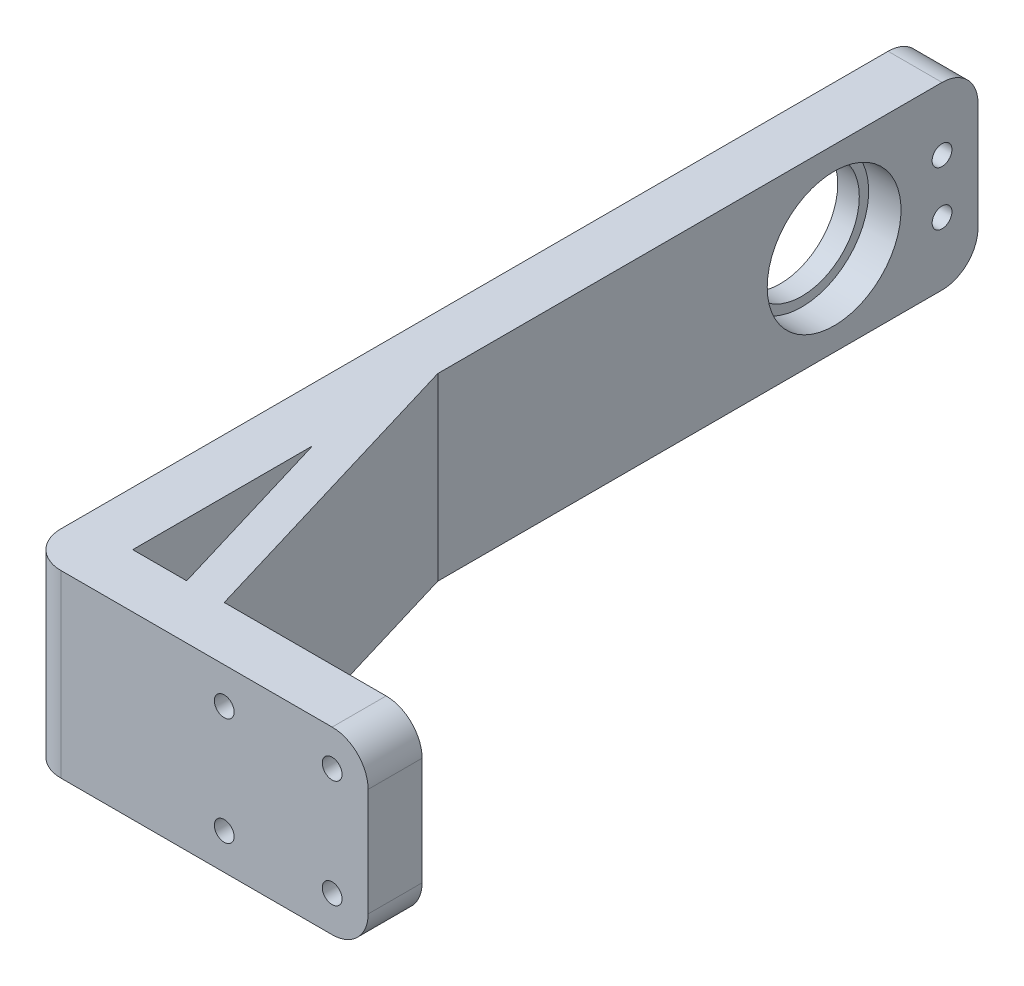
ISO-10303-21;
HEADER;
FILE_DESCRIPTION(('STEP AP214'),'2;1');
FILE_NAME('part.step','',(''),(''),'','','');
FILE_SCHEMA(('AUTOMOTIVE_DESIGN { 1 0 10303 214 1 1 1 1 }'));
ENDSEC;
DATA;
#1=APPLICATION_CONTEXT('core data for automotive mechanical design processes');
#2=APPLICATION_PROTOCOL_DEFINITION('international standard','automotive_design',2000,#1);
#3=PRODUCT_CONTEXT('',#1,'mechanical');
#4=PRODUCT('Part','Part','',(#3));
#5=PRODUCT_RELATED_PRODUCT_CATEGORY('part','',(#4));
#6=PRODUCT_DEFINITION_FORMATION('','',#4);
#7=PRODUCT_DEFINITION_CONTEXT('part definition',#1,'design');
#8=PRODUCT_DEFINITION('design','',#6,#7);
#9=PRODUCT_DEFINITION_SHAPE('','',#8);
#10=(LENGTH_UNIT() NAMED_UNIT(*) SI_UNIT(.MILLI.,.METRE.));
#11=(NAMED_UNIT(*) PLANE_ANGLE_UNIT() SI_UNIT($,.RADIAN.));
#12=(NAMED_UNIT(*) SI_UNIT($,.STERADIAN.) SOLID_ANGLE_UNIT());
#13=UNCERTAINTY_MEASURE_WITH_UNIT(LENGTH_MEASURE(1.E-05),#10,'distance_accuracy_value','');
#14=(GEOMETRIC_REPRESENTATION_CONTEXT(3) GLOBAL_UNCERTAINTY_ASSIGNED_CONTEXT((#13)) GLOBAL_UNIT_ASSIGNED_CONTEXT((#10,
#11,#12)) REPRESENTATION_CONTEXT('',''));
#15=CARTESIAN_POINT('',(0.,0.,0.));
#16=DIRECTION('',(0.,0.,1.));
#17=DIRECTION('',(1.,0.,0.));
#18=AXIS2_PLACEMENT_3D('',#15,#16,#17);
#19=CARTESIAN_POINT('',(15.,50.,0.));
#20=DIRECTION('',(-1.,0.,0.));
#21=DIRECTION('',(0.,0.,1.));
#22=AXIS2_PLACEMENT_3D('',#19,#20,#21);
#23=PLANE('',#22);
#24=DIRECTION('',(0.,0.,-1.));
#25=VECTOR('',#24,1.);
#26=CARTESIAN_POINT('',(15.,0.,0.));
#27=LINE('',#26,#25);
#28=CARTESIAN_POINT('',(15.,0.,-15.));
#29=VERTEX_POINT('',#28);
#30=CARTESIAN_POINT('',(15.,0.,-65.));
#31=VERTEX_POINT('',#30);
#32=EDGE_CURVE('E272',#29,#31,#27,.T.);
#33=ORIENTED_EDGE('',*,*,#32,.T.);
#34=DIRECTION('',(0.,-1.,0.));
#35=VECTOR('',#34,1.);
#36=CARTESIAN_POINT('',(15.,50.,-65.));
#37=LINE('',#36,#35);
#38=CARTESIAN_POINT('',(15.,50.,-65.));
#39=VERTEX_POINT('',#38);
#40=EDGE_CURVE('E195',#39,#31,#37,.T.);
#41=ORIENTED_EDGE('',*,*,#40,.F.);
#42=DIRECTION('',(0.,0.,-1.));
#43=VECTOR('',#42,1.);
#44=CARTESIAN_POINT('',(15.,50.,0.));
#45=LINE('',#44,#43);
#46=CARTESIAN_POINT('',(15.,50.,-15.));
#47=VERTEX_POINT('',#46);
#48=EDGE_CURVE('E160',#47,#39,#45,.T.);
#49=ORIENTED_EDGE('',*,*,#48,.F.);
#50=DIRECTION('',(0.,-1.,0.));
#51=VECTOR('',#50,1.);
#52=CARTESIAN_POINT('',(15.,50.,-15.));
#53=LINE('',#52,#51);
#54=EDGE_CURVE('E176',#47,#29,#53,.T.);
#55=ORIENTED_EDGE('',*,*,#54,.T.);
#56=EDGE_LOOP('',(#33,#41,#49,#55));
#57=FACE_BOUND('',#56,.T.);
#58=ADVANCED_FACE('F41',(#57),#23,.F.);
#59=CARTESIAN_POINT('',(31.651376146789,50.,-9.4954128440367));
#60=DIRECTION('',(0.957826285221152,0.,-0.287347885566345));
#61=DIRECTION('',(-0.287347885566345,0.,-0.957826285221152));
#62=AXIS2_PLACEMENT_3D('',#59,#60,#61);
#63=PLANE('',#62);
#64=DIRECTION('',(0.287347885566345,0.,0.957826285221151));
#65=VECTOR('',#64,1.);
#66=CARTESIAN_POINT('',(31.651376146789,0.,-9.4954128440367));
#67=LINE('',#66,#65);
#68=CARTESIAN_POINT('',(30.,0.,-15.));
#69=VERTEX_POINT('',#68);
#70=EDGE_CURVE('E278',#31,#69,#67,.T.);
#71=ORIENTED_EDGE('',*,*,#70,.T.);
#72=DIRECTION('',(0.,-1.,0.));
#73=VECTOR('',#72,1.);
#74=CARTESIAN_POINT('',(30.,50.,-15.));
#75=LINE('',#74,#73);
#76=CARTESIAN_POINT('',(30.,50.,-15.));
#77=VERTEX_POINT('',#76);
#78=EDGE_CURVE('E180',#77,#69,#75,.T.);
#79=ORIENTED_EDGE('',*,*,#78,.F.);
#80=DIRECTION('',(0.287347885566345,0.,0.957826285221151));
#81=VECTOR('',#80,1.);
#82=CARTESIAN_POINT('',(31.651376146789,50.,-9.4954128440367));
#83=LINE('',#82,#81);
#84=EDGE_CURVE('E269',#39,#77,#83,.T.);
#85=ORIENTED_EDGE('',*,*,#84,.F.);
#86=ORIENTED_EDGE('',*,*,#40,.T.);
#87=EDGE_LOOP('',(#71,#79,#85,#86));
#88=FACE_BOUND('',#87,.T.);
#89=ADVANCED_FACE('F327',(#88),#63,.F.);
#90=CARTESIAN_POINT('',(41.2296389990005,50.,-12.3688916997002));
#91=DIRECTION('',(-0.957826285221151,0.,0.287347885566345));
#92=DIRECTION('',(0.287347885566346,0.,0.957826285221152));
#93=AXIS2_PLACEMENT_3D('',#90,#91,#92);
#94=PLANE('',#93);
#95=DIRECTION('',(-0.287347885566346,0.,-0.957826285221151));
#96=VECTOR('',#95,1.);
#97=CARTESIAN_POINT('',(41.2296389990005,0.,-12.3688916997002));
#98=LINE('',#97,#96);
#99=CARTESIAN_POINT('',(40.4403065089105,0.,-15.));
#100=VERTEX_POINT('',#99);
#101=CARTESIAN_POINT('',(15.,0.,-99.8010216963685));
#102=VERTEX_POINT('',#101);
#103=EDGE_CURVE('E175',#100,#102,#98,.T.);
#104=ORIENTED_EDGE('',*,*,#103,.T.);
#105=DIRECTION('',(0.,-1.,0.));
#106=VECTOR('',#105,1.);
#107=CARTESIAN_POINT('',(15.,50.,-99.8010216963685));
#108=LINE('',#107,#106);
#109=CARTESIAN_POINT('',(15.,50.,-99.8010216963685));
#110=VERTEX_POINT('',#109);
#111=EDGE_CURVE('E151',#110,#102,#108,.T.);
#112=ORIENTED_EDGE('',*,*,#111,.F.);
#113=DIRECTION('',(-0.287347885566346,0.,-0.957826285221151));
#114=VECTOR('',#113,1.);
#115=CARTESIAN_POINT('',(41.2296389990005,50.,-12.3688916997002));
#116=LINE('',#115,#114);
#117=CARTESIAN_POINT('',(40.4403065089105,50.,-15.));
#118=VERTEX_POINT('',#117);
#119=EDGE_CURVE('E158',#118,#110,#116,.T.);
#120=ORIENTED_EDGE('',*,*,#119,.F.);
#121=DIRECTION('',(0.,-1.,0.));
#122=VECTOR('',#121,1.);
#123=CARTESIAN_POINT('',(40.4403065089105,50.,-15.));
#124=LINE('',#123,#122);
#125=EDGE_CURVE('E284',#118,#100,#124,.T.);
#126=ORIENTED_EDGE('',*,*,#125,.T.);
#127=EDGE_LOOP('',(#104,#112,#120,#126));
#128=FACE_BOUND('',#127,.T.);
#129=ADVANCED_FACE('F173',(#128),#94,.F.);
#130=CARTESIAN_POINT('',(15.,32.5,-240.));
#131=DIRECTION('',(-1.,0.,0.));
#132=DIRECTION('',(0.,0.,1.));
#133=AXIS2_PLACEMENT_3D('',#130,#131,#132);
#134=CIRCLE('',#133,2.74999999999998);
#135=CARTESIAN_POINT('',(15.,32.5,-237.25));
#136=VERTEX_POINT('',#135);
#137=EDGE_CURVE('E209',#136,#136,#134,.T.);
#138=ORIENTED_EDGE('',*,*,#137,.T.);
#139=EDGE_LOOP('',(#138));
#140=FACE_BOUND('',#139,.T.);
#141=CARTESIAN_POINT('',(15.,17.5,-240.));
#142=DIRECTION('',(-1.,0.,0.));
#143=DIRECTION('',(0.,0.,1.));
#144=AXIS2_PLACEMENT_3D('',#141,#142,#143);
#145=CIRCLE('',#144,2.74999999999998);
#146=CARTESIAN_POINT('',(15.,17.5,-237.25));
#147=VERTEX_POINT('',#146);
#148=EDGE_CURVE('E204',#147,#147,#145,.T.);
#149=ORIENTED_EDGE('',*,*,#148,.T.);
#150=EDGE_LOOP('',(#149));
#151=FACE_BOUND('',#150,.T.);
#152=CARTESIAN_POINT('',(15.,25.,-210.));
#153=DIRECTION('',(-1.,0.,0.));
#154=DIRECTION('',(0.,0.,1.));
#155=AXIS2_PLACEMENT_3D('',#152,#153,#154);
#156=CIRCLE('',#155,18.6);
#157=CARTESIAN_POINT('',(15.,25.,-191.4));
#158=VERTEX_POINT('',#157);
#159=EDGE_CURVE('E207',#158,#158,#156,.T.);
#160=ORIENTED_EDGE('',*,*,#159,.T.);
#161=EDGE_LOOP('',(#160));
#162=FACE_BOUND('',#161,.T.);
#163=CARTESIAN_POINT('',(15.,0.,-240.));
#164=VERTEX_POINT('',#163);
#165=EDGE_CURVE('E256',#102,#164,#27,.T.);
#166=ORIENTED_EDGE('',*,*,#165,.T.);
#167=CARTESIAN_POINT('',(15.,10.,-240.));
#168=DIRECTION('',(-1.,0.,0.));
#169=DIRECTION('',(0.,0.,1.));
#170=AXIS2_PLACEMENT_3D('',#167,#168,#169);
#171=CIRCLE('',#170,10.);
#172=CARTESIAN_POINT('',(15.,10.,-250.));
#173=VERTEX_POINT('',#172);
#174=EDGE_CURVE('E11',#164,#173,#171,.F.);
#175=ORIENTED_EDGE('',*,*,#174,.T.);
#176=DIRECTION('',(0.,-1.,0.));
#177=VECTOR('',#176,1.);
#178=CARTESIAN_POINT('',(15.,50.,-250.));
#179=LINE('',#178,#177);
#180=CARTESIAN_POINT('',(15.,40.,-250.));
#181=VERTEX_POINT('',#180);
#182=EDGE_CURVE('E177',#181,#173,#179,.T.);
#183=ORIENTED_EDGE('',*,*,#182,.F.);
#184=CARTESIAN_POINT('',(15.,40.,-240.));
#185=DIRECTION('',(-1.,0.,0.));
#186=DIRECTION('',(0.,0.,1.));
#187=AXIS2_PLACEMENT_3D('',#184,#185,#186);
#188=CIRCLE('',#187,10.);
#189=CARTESIAN_POINT('',(15.,50.,-240.));
#190=VERTEX_POINT('',#189);
#191=EDGE_CURVE('E49',#181,#190,#188,.F.);
#192=ORIENTED_EDGE('',*,*,#191,.T.);
#193=EDGE_CURVE('E147',#110,#190,#45,.T.);
#194=ORIENTED_EDGE('',*,*,#193,.F.);
#195=ORIENTED_EDGE('',*,*,#111,.T.);
#196=EDGE_LOOP('',(#166,#175,#183,#192,#194,#195));
#197=FACE_BOUND('',#196,.T.);
#198=ADVANCED_FACE('F149',(#140,#151,#162,#197),#23,.F.);
#199=CARTESIAN_POINT('',(0.,50.,-250.));
#200=DIRECTION('',(0.,0.,1.));
#201=DIRECTION('',(1.,0.,0.));
#202=AXIS2_PLACEMENT_3D('',#199,#200,#201);
#203=PLANE('',#202);
#204=ORIENTED_EDGE('',*,*,#182,.T.);
#205=DIRECTION('',(-1.,0.,0.));
#206=VECTOR('',#205,1.);
#207=CARTESIAN_POINT('',(0.,10.,-250.));
#208=LINE('',#207,#206);
#209=CARTESIAN_POINT('',(0.,10.,-250.));
#210=VERTEX_POINT('',#209);
#211=EDGE_CURVE('E235',#173,#210,#208,.T.);
#212=ORIENTED_EDGE('',*,*,#211,.T.);
#213=DIRECTION('',(0.,-1.,0.));
#214=VECTOR('',#213,1.);
#215=CARTESIAN_POINT('',(0.,50.,-250.));
#216=LINE('',#215,#214);
#217=CARTESIAN_POINT('',(0.,40.,-250.));
#218=VERTEX_POINT('',#217);
#219=EDGE_CURVE('E182',#218,#210,#216,.T.);
#220=ORIENTED_EDGE('',*,*,#219,.F.);
#221=DIRECTION('',(-1.,0.,0.));
#222=VECTOR('',#221,1.);
#223=CARTESIAN_POINT('',(15.,40.,-250.));
#224=LINE('',#223,#222);
#225=EDGE_CURVE('E61',#218,#181,#224,.F.);
#226=ORIENTED_EDGE('',*,*,#225,.T.);
#227=EDGE_LOOP('',(#204,#212,#220,#226));
#228=FACE_BOUND('',#227,.T.);
#229=ADVANCED_FACE('F259',(#228),#203,.F.);
#230=CARTESIAN_POINT('',(0.,50.,0.));
#231=DIRECTION('',(1.,0.,0.));
#232=DIRECTION('',(0.,0.,-1.));
#233=AXIS2_PLACEMENT_3D('',#230,#231,#232);
#234=PLANE('',#233);
#235=CARTESIAN_POINT('',(0.,32.5,-240.));
#236=DIRECTION('',(-1.,0.,0.));
#237=DIRECTION('',(0.,0.,1.));
#238=AXIS2_PLACEMENT_3D('',#235,#236,#237);
#239=CIRCLE('',#238,2.775);
#240=CARTESIAN_POINT('',(0.,32.5,-237.225));
#241=VERTEX_POINT('',#240);
#242=EDGE_CURVE('E424',#241,#241,#239,.T.);
#243=ORIENTED_EDGE('',*,*,#242,.F.);
#244=EDGE_LOOP('',(#243));
#245=FACE_BOUND('',#244,.T.);
#246=CARTESIAN_POINT('',(0.,17.5,-240.));
#247=DIRECTION('',(-1.,0.,0.));
#248=DIRECTION('',(0.,0.,1.));
#249=AXIS2_PLACEMENT_3D('',#246,#247,#248);
#250=CIRCLE('',#249,2.775);
#251=CARTESIAN_POINT('',(0.,17.5,-237.225));
#252=VERTEX_POINT('',#251);
#253=EDGE_CURVE('E212',#252,#252,#250,.T.);
#254=ORIENTED_EDGE('',*,*,#253,.F.);
#255=EDGE_LOOP('',(#254));
#256=FACE_BOUND('',#255,.T.);
#257=CARTESIAN_POINT('',(0.,25.,-210.));
#258=DIRECTION('',(1.,0.,0.));
#259=DIRECTION('',(0.,0.,-1.));
#260=AXIS2_PLACEMENT_3D('',#257,#258,#259);
#261=CIRCLE('',#260,16.);
#262=CARTESIAN_POINT('',(0.,25.,-226.));
#263=VERTEX_POINT('',#262);
#264=EDGE_CURVE('E189',#263,#263,#261,.T.);
#265=ORIENTED_EDGE('',*,*,#264,.T.);
#266=EDGE_LOOP('',(#265));
#267=FACE_BOUND('',#266,.T.);
#268=ORIENTED_EDGE('',*,*,#219,.T.);
#269=CARTESIAN_POINT('',(0.,10.,-240.));
#270=DIRECTION('',(1.,0.,0.));
#271=DIRECTION('',(0.,0.,-1.));
#272=AXIS2_PLACEMENT_3D('',#269,#270,#271);
#273=CIRCLE('',#272,10.);
#274=CARTESIAN_POINT('',(0.,0.,-240.));
#275=VERTEX_POINT('',#274);
#276=EDGE_CURVE('E240',#210,#275,#273,.F.);
#277=ORIENTED_EDGE('',*,*,#276,.T.);
#278=DIRECTION('',(0.,0.,1.));
#279=VECTOR('',#278,1.);
#280=CARTESIAN_POINT('',(0.,0.,0.));
#281=LINE('',#280,#279);
#282=CARTESIAN_POINT('',(0.,0.,-10.));
#283=VERTEX_POINT('',#282);
#284=EDGE_CURVE('E245',#275,#283,#281,.T.);
#285=ORIENTED_EDGE('',*,*,#284,.T.);
#286=DIRECTION('',(0.,-1.,0.));
#287=VECTOR('',#286,1.);
#288=CARTESIAN_POINT('',(0.,50.,-10.));
#289=LINE('',#288,#287);
#290=CARTESIAN_POINT('',(0.,50.,-10.));
#291=VERTEX_POINT('',#290);
#292=EDGE_CURVE('E198',#283,#291,#289,.F.);
#293=ORIENTED_EDGE('',*,*,#292,.T.);
#294=DIRECTION('',(0.,0.,1.));
#295=VECTOR('',#294,1.);
#296=CARTESIAN_POINT('',(0.,50.,0.));
#297=LINE('',#296,#295);
#298=CARTESIAN_POINT('',(0.,50.,-240.));
#299=VERTEX_POINT('',#298);
#300=EDGE_CURVE('E157',#299,#291,#297,.T.);
#301=ORIENTED_EDGE('',*,*,#300,.F.);
#302=CARTESIAN_POINT('',(0.,40.,-240.));
#303=DIRECTION('',(1.,0.,0.));
#304=DIRECTION('',(0.,0.,-1.));
#305=AXIS2_PLACEMENT_3D('',#302,#303,#304);
#306=CIRCLE('',#305,10.);
#307=EDGE_CURVE('E238',#299,#218,#306,.F.);
#308=ORIENTED_EDGE('',*,*,#307,.T.);
#309=EDGE_LOOP('',(#268,#277,#285,#293,#301,#308));
#310=FACE_BOUND('',#309,.T.);
#311=ADVANCED_FACE('F244',(#245,#256,#267,#310),#234,.F.);
#312=CARTESIAN_POINT('',(0.,50.,0.));
#313=DIRECTION('',(0.,0.,-1.));
#314=DIRECTION('',(-1.,0.,0.));
#315=AXIS2_PLACEMENT_3D('',#312,#313,#314);
#316=PLANE('',#315);
#317=CARTESIAN_POINT('',(85.4403065089106,40.,0.));
#318=DIRECTION('',(0.,0.,-1.));
#319=DIRECTION('',(-1.,0.,0.));
#320=AXIS2_PLACEMENT_3D('',#317,#318,#319);
#321=CIRCLE('',#320,2.74999999999999);
#322=CARTESIAN_POINT('',(82.6903065089106,40.,0.));
#323=VERTEX_POINT('',#322);
#324=EDGE_CURVE('E695',#323,#323,#321,.T.);
#325=ORIENTED_EDGE('',*,*,#324,.T.);
#326=EDGE_LOOP('',(#325));
#327=FACE_BOUND('',#326,.T.);
#328=CARTESIAN_POINT('',(55.4403065089106,10.,0.));
#329=DIRECTION('',(0.,0.,-1.));
#330=DIRECTION('',(-1.,0.,0.));
#331=AXIS2_PLACEMENT_3D('',#328,#329,#330);
#332=CIRCLE('',#331,2.74999999999999);
#333=CARTESIAN_POINT('',(52.6903065089106,10.,0.));
#334=VERTEX_POINT('',#333);
#335=EDGE_CURVE('E707',#334,#334,#332,.T.);
#336=ORIENTED_EDGE('',*,*,#335,.T.);
#337=EDGE_LOOP('',(#336));
#338=FACE_BOUND('',#337,.T.);
#339=CARTESIAN_POINT('',(85.4403065089106,10.,0.));
#340=DIRECTION('',(0.,0.,-1.));
#341=DIRECTION('',(-1.,0.,0.));
#342=AXIS2_PLACEMENT_3D('',#339,#340,#341);
#343=CIRCLE('',#342,2.74999999999999);
#344=CARTESIAN_POINT('',(82.6903065089106,10.,0.));
#345=VERTEX_POINT('',#344);
#346=EDGE_CURVE('E412',#345,#345,#343,.T.);
#347=ORIENTED_EDGE('',*,*,#346,.T.);
#348=EDGE_LOOP('',(#347));
#349=FACE_BOUND('',#348,.T.);
#350=CARTESIAN_POINT('',(55.4403065089106,40.,0.));
#351=DIRECTION('',(0.,0.,-1.));
#352=DIRECTION('',(-1.,0.,0.));
#353=AXIS2_PLACEMENT_3D('',#350,#351,#352);
#354=CIRCLE('',#353,2.74999999999999);
#355=CARTESIAN_POINT('',(52.6903065089106,40.,0.));
#356=VERTEX_POINT('',#355);
#357=EDGE_CURVE('E415',#356,#356,#354,.T.);
#358=ORIENTED_EDGE('',*,*,#357,.T.);
#359=EDGE_LOOP('',(#358));
#360=FACE_BOUND('',#359,.T.);
#361=DIRECTION('',(0.,-1.,0.));
#362=VECTOR('',#361,1.);
#363=CARTESIAN_POINT('',(95.4403065089106,50.,0.));
#364=LINE('',#363,#362);
#365=CARTESIAN_POINT('',(95.4403065089106,40.,0.));
#366=VERTEX_POINT('',#365);
#367=CARTESIAN_POINT('',(95.4403065089106,10.,0.));
#368=VERTEX_POINT('',#367);
#369=EDGE_CURVE('E289',#366,#368,#364,.T.);
#370=ORIENTED_EDGE('',*,*,#369,.F.);
#371=CARTESIAN_POINT('',(85.4403065089106,40.,0.));
#372=DIRECTION('',(0.,0.,-1.));
#373=DIRECTION('',(-1.,0.,0.));
#374=AXIS2_PLACEMENT_3D('',#371,#372,#373);
#375=CIRCLE('',#374,10.);
#376=CARTESIAN_POINT('',(85.4403065089106,50.,0.));
#377=VERTEX_POINT('',#376);
#378=EDGE_CURVE('E228',#366,#377,#375,.F.);
#379=ORIENTED_EDGE('',*,*,#378,.T.);
#380=DIRECTION('',(1.,0.,0.));
#381=VECTOR('',#380,1.);
#382=CARTESIAN_POINT('',(0.,50.,0.));
#383=LINE('',#382,#381);
#384=CARTESIAN_POINT('',(10.,50.,0.));
#385=VERTEX_POINT('',#384);
#386=EDGE_CURVE('E263',#385,#377,#383,.T.);
#387=ORIENTED_EDGE('',*,*,#386,.F.);
#388=DIRECTION('',(0.,-1.,0.));
#389=VECTOR('',#388,1.);
#390=CARTESIAN_POINT('',(10.,50.,0.));
#391=LINE('',#390,#389);
#392=CARTESIAN_POINT('',(10.,0.,0.));
#393=VERTEX_POINT('',#392);
#394=EDGE_CURVE('E191',#385,#393,#391,.T.);
#395=ORIENTED_EDGE('',*,*,#394,.T.);
#396=DIRECTION('',(1.,0.,0.));
#397=VECTOR('',#396,1.);
#398=CARTESIAN_POINT('',(0.,0.,0.));
#399=LINE('',#398,#397);
#400=CARTESIAN_POINT('',(85.4403065089106,0.,0.));
#401=VERTEX_POINT('',#400);
#402=EDGE_CURVE('E255',#393,#401,#399,.T.);
#403=ORIENTED_EDGE('',*,*,#402,.T.);
#404=CARTESIAN_POINT('',(85.4403065089106,10.,0.));
#405=DIRECTION('',(0.,0.,-1.));
#406=DIRECTION('',(-1.,0.,0.));
#407=AXIS2_PLACEMENT_3D('',#404,#405,#406);
#408=CIRCLE('',#407,10.);
#409=EDGE_CURVE('E226',#401,#368,#408,.F.);
#410=ORIENTED_EDGE('',*,*,#409,.T.);
#411=EDGE_LOOP('',(#370,#379,#387,#395,#403,#410));
#412=FACE_BOUND('',#411,.T.);
#413=ADVANCED_FACE('F305',(#327,#338,#349,#360,#412),#316,.F.);
#414=CARTESIAN_POINT('',(95.4403065089106,50.,0.));
#415=DIRECTION('',(-1.,0.,0.));
#416=DIRECTION('',(0.,0.,1.));
#417=AXIS2_PLACEMENT_3D('',#414,#415,#416);
#418=PLANE('',#417);
#419=DIRECTION('',(0.,-1.,0.));
#420=VECTOR('',#419,1.);
#421=CARTESIAN_POINT('',(95.4403065089106,50.,-15.));
#422=LINE('',#421,#420);
#423=CARTESIAN_POINT('',(95.4403065089106,40.,-15.));
#424=VERTEX_POINT('',#423);
#425=CARTESIAN_POINT('',(95.4403065089106,10.,-15.));
#426=VERTEX_POINT('',#425);
#427=EDGE_CURVE('E286',#424,#426,#422,.T.);
#428=ORIENTED_EDGE('',*,*,#427,.F.);
#429=DIRECTION('',(0.,0.,-1.));
#430=VECTOR('',#429,1.);
#431=CARTESIAN_POINT('',(95.4403065089106,40.,0.));
#432=LINE('',#431,#430);
#433=EDGE_CURVE('E224',#424,#366,#432,.F.);
#434=ORIENTED_EDGE('',*,*,#433,.T.);
#435=ORIENTED_EDGE('',*,*,#369,.T.);
#436=DIRECTION('',(0.,0.,-1.));
#437=VECTOR('',#436,1.);
#438=CARTESIAN_POINT('',(95.4403065089106,10.,0.));
#439=LINE('',#438,#437);
#440=EDGE_CURVE('E221',#368,#426,#439,.T.);
#441=ORIENTED_EDGE('',*,*,#440,.T.);
#442=EDGE_LOOP('',(#428,#434,#435,#441));
#443=FACE_BOUND('',#442,.T.);
#444=ADVANCED_FACE('F295',(#443),#418,.F.);
#445=CARTESIAN_POINT('',(0.,50.,-15.));
#446=DIRECTION('',(0.,0.,1.));
#447=DIRECTION('',(1.,0.,0.));
#448=AXIS2_PLACEMENT_3D('',#445,#446,#447);
#449=PLANE('',#448);
#450=CARTESIAN_POINT('',(85.4403065089106,40.,-15.));
#451=DIRECTION('',(0.,0.,-1.));
#452=DIRECTION('',(-1.,0.,0.));
#453=AXIS2_PLACEMENT_3D('',#450,#451,#452);
#454=CIRCLE('',#453,2.775);
#455=CARTESIAN_POINT('',(82.6653065089106,40.,-15.));
#456=VERTEX_POINT('',#455);
#457=EDGE_CURVE('E398',#456,#456,#454,.T.);
#458=ORIENTED_EDGE('',*,*,#457,.F.);
#459=EDGE_LOOP('',(#458));
#460=FACE_BOUND('',#459,.T.);
#461=CARTESIAN_POINT('',(55.4403065089106,10.,-15.));
#462=DIRECTION('',(0.,0.,-1.));
#463=DIRECTION('',(-1.,0.,0.));
#464=AXIS2_PLACEMENT_3D('',#461,#462,#463);
#465=CIRCLE('',#464,2.775);
#466=CARTESIAN_POINT('',(52.6653065089106,10.,-15.));
#467=VERTEX_POINT('',#466);
#468=EDGE_CURVE('E402',#467,#467,#465,.T.);
#469=ORIENTED_EDGE('',*,*,#468,.F.);
#470=EDGE_LOOP('',(#469));
#471=FACE_BOUND('',#470,.T.);
#472=CARTESIAN_POINT('',(85.4403065089106,10.,-15.));
#473=DIRECTION('',(0.,0.,-1.));
#474=DIRECTION('',(-1.,0.,0.));
#475=AXIS2_PLACEMENT_3D('',#472,#473,#474);
#476=CIRCLE('',#475,2.775);
#477=CARTESIAN_POINT('',(82.6653065089106,10.,-15.));
#478=VERTEX_POINT('',#477);
#479=EDGE_CURVE('E406',#478,#478,#476,.T.);
#480=ORIENTED_EDGE('',*,*,#479,.F.);
#481=EDGE_LOOP('',(#480));
#482=FACE_BOUND('',#481,.T.);
#483=CARTESIAN_POINT('',(55.4403065089106,40.,-15.));
#484=DIRECTION('',(0.,0.,-1.));
#485=DIRECTION('',(-1.,0.,0.));
#486=AXIS2_PLACEMENT_3D('',#483,#484,#485);
#487=CIRCLE('',#486,2.775);
#488=CARTESIAN_POINT('',(52.6653065089106,40.,-15.));
#489=VERTEX_POINT('',#488);
#490=EDGE_CURVE('E409',#489,#489,#487,.T.);
#491=ORIENTED_EDGE('',*,*,#490,.F.);
#492=EDGE_LOOP('',(#491));
#493=FACE_BOUND('',#492,.T.);
#494=DIRECTION('',(-1.,0.,0.));
#495=VECTOR('',#494,1.);
#496=CARTESIAN_POINT('',(0.,50.,-15.));
#497=LINE('',#496,#495);
#498=CARTESIAN_POINT('',(85.4403065089106,50.,-15.));
#499=VERTEX_POINT('',#498);
#500=EDGE_CURVE('E167',#499,#118,#497,.T.);
#501=ORIENTED_EDGE('',*,*,#500,.F.);
#502=CARTESIAN_POINT('',(85.4403065089106,40.,-15.));
#503=DIRECTION('',(0.,0.,1.));
#504=DIRECTION('',(1.,0.,0.));
#505=AXIS2_PLACEMENT_3D('',#502,#503,#504);
#506=CIRCLE('',#505,10.);
#507=EDGE_CURVE('E219',#499,#424,#506,.F.);
#508=ORIENTED_EDGE('',*,*,#507,.T.);
#509=ORIENTED_EDGE('',*,*,#427,.T.);
#510=CARTESIAN_POINT('',(85.4403065089106,10.,-15.));
#511=DIRECTION('',(0.,0.,1.));
#512=DIRECTION('',(1.,0.,0.));
#513=AXIS2_PLACEMENT_3D('',#510,#511,#512);
#514=CIRCLE('',#513,10.);
#515=CARTESIAN_POINT('',(85.4403065089106,0.,-15.));
#516=VERTEX_POINT('',#515);
#517=EDGE_CURVE('E217',#426,#516,#514,.F.);
#518=ORIENTED_EDGE('',*,*,#517,.T.);
#519=DIRECTION('',(-1.,0.,0.));
#520=VECTOR('',#519,1.);
#521=CARTESIAN_POINT('',(0.,0.,-15.));
#522=LINE('',#521,#520);
#523=EDGE_CURVE('E276',#516,#100,#522,.T.);
#524=ORIENTED_EDGE('',*,*,#523,.T.);
#525=ORIENTED_EDGE('',*,*,#125,.F.);
#526=EDGE_LOOP('',(#501,#508,#509,#518,#524,#525));
#527=FACE_BOUND('',#526,.T.);
#528=ADVANCED_FACE('F304',(#460,#471,#482,#493,#527),#449,.F.);
#529=EDGE_CURVE('E171',#69,#29,#522,.T.);
#530=ORIENTED_EDGE('',*,*,#529,.T.);
#531=ORIENTED_EDGE('',*,*,#54,.F.);
#532=EDGE_CURVE('E268',#77,#47,#497,.T.);
#533=ORIENTED_EDGE('',*,*,#532,.F.);
#534=ORIENTED_EDGE('',*,*,#78,.T.);
#535=EDGE_LOOP('',(#530,#531,#533,#534));
#536=FACE_BOUND('',#535,.T.);
#537=ADVANCED_FACE('F377',(#536),#449,.F.);
#538=CARTESIAN_POINT('',(0.,50.,0.));
#539=DIRECTION('',(0.,1.,0.));
#540=DIRECTION('',(0.,0.,1.));
#541=AXIS2_PLACEMENT_3D('',#538,#539,#540);
#542=PLANE('',#541);
#543=ORIENTED_EDGE('',*,*,#386,.T.);
#544=DIRECTION('',(0.,0.,-1.));
#545=VECTOR('',#544,1.);
#546=CARTESIAN_POINT('',(85.4403065089106,50.,-15.));
#547=LINE('',#546,#545);
#548=EDGE_CURVE('E215',#377,#499,#547,.T.);
#549=ORIENTED_EDGE('',*,*,#548,.T.);
#550=ORIENTED_EDGE('',*,*,#500,.T.);
#551=ORIENTED_EDGE('',*,*,#119,.T.);
#552=ORIENTED_EDGE('',*,*,#193,.T.);
#553=DIRECTION('',(-1.,0.,0.));
#554=VECTOR('',#553,1.);
#555=CARTESIAN_POINT('',(0.,50.,-240.));
#556=LINE('',#555,#554);
#557=EDGE_CURVE('E203',#190,#299,#556,.T.);
#558=ORIENTED_EDGE('',*,*,#557,.T.);
#559=ORIENTED_EDGE('',*,*,#300,.T.);
#560=CARTESIAN_POINT('',(10.,50.,-10.));
#561=DIRECTION('',(0.,1.,0.));
#562=DIRECTION('',(0.,0.,1.));
#563=AXIS2_PLACEMENT_3D('',#560,#561,#562);
#564=CIRCLE('',#563,10.);
#565=EDGE_CURVE('E201',#291,#385,#564,.T.);
#566=ORIENTED_EDGE('',*,*,#565,.T.);
#567=EDGE_LOOP('',(#543,#549,#550,#551,#552,#558,#559,#566));
#568=FACE_BOUND('',#567,.T.);
#569=ORIENTED_EDGE('',*,*,#48,.T.);
#570=ORIENTED_EDGE('',*,*,#84,.T.);
#571=ORIENTED_EDGE('',*,*,#532,.T.);
#572=EDGE_LOOP('',(#569,#570,#571));
#573=FACE_BOUND('',#572,.T.);
#574=ADVANCED_FACE('F163',(#568,#573),#542,.T.);
#575=CARTESIAN_POINT('',(0.,0.,0.));
#576=DIRECTION('',(0.,1.,0.));
#577=DIRECTION('',(0.,0.,1.));
#578=AXIS2_PLACEMENT_3D('',#575,#576,#577);
#579=PLANE('',#578);
#580=ORIENTED_EDGE('',*,*,#523,.F.);
#581=DIRECTION('',(0.,0.,-1.));
#582=VECTOR('',#581,1.);
#583=CARTESIAN_POINT('',(85.4403065089106,0.,0.));
#584=LINE('',#583,#582);
#585=EDGE_CURVE('E232',#516,#401,#584,.F.);
#586=ORIENTED_EDGE('',*,*,#585,.T.);
#587=ORIENTED_EDGE('',*,*,#402,.F.);
#588=CARTESIAN_POINT('',(10.,0.,-10.));
#589=DIRECTION('',(0.,1.,0.));
#590=DIRECTION('',(0.,0.,1.));
#591=AXIS2_PLACEMENT_3D('',#588,#589,#590);
#592=CIRCLE('',#591,10.);
#593=EDGE_CURVE('E194',#393,#283,#592,.F.);
#594=ORIENTED_EDGE('',*,*,#593,.T.);
#595=ORIENTED_EDGE('',*,*,#284,.F.);
#596=DIRECTION('',(-1.,0.,0.));
#597=VECTOR('',#596,1.);
#598=CARTESIAN_POINT('',(0.,0.,-240.));
#599=LINE('',#598,#597);
#600=EDGE_CURVE('E230',#275,#164,#599,.F.);
#601=ORIENTED_EDGE('',*,*,#600,.T.);
#602=ORIENTED_EDGE('',*,*,#165,.F.);
#603=ORIENTED_EDGE('',*,*,#103,.F.);
#604=EDGE_LOOP('',(#580,#586,#587,#594,#595,#601,#602,#603));
#605=FACE_BOUND('',#604,.T.);
#606=ORIENTED_EDGE('',*,*,#32,.F.);
#607=ORIENTED_EDGE('',*,*,#529,.F.);
#608=ORIENTED_EDGE('',*,*,#70,.F.);
#609=EDGE_LOOP('',(#606,#607,#608));
#610=FACE_BOUND('',#609,.T.);
#611=ADVANCED_FACE('F251',(#605,#610),#579,.F.);
#612=CARTESIAN_POINT('',(0.,25.,-210.));
#613=DIRECTION('',(1.,0.,0.));
#614=DIRECTION('',(0.,0.,-1.));
#615=AXIS2_PLACEMENT_3D('',#612,#613,#614);
#616=CYLINDRICAL_SURFACE('',#615,16.);
#617=CARTESIAN_POINT('',(6.,25.,-210.));
#618=DIRECTION('',(-1.,0.,0.));
#619=DIRECTION('',(0.,0.,1.));
#620=AXIS2_PLACEMENT_3D('',#617,#618,#619);
#621=CIRCLE('',#620,16.);
#622=CARTESIAN_POINT('',(6.,25.,-194.));
#623=VERTEX_POINT('',#622);
#624=EDGE_CURVE('E186',#623,#623,#621,.F.);
#625=ORIENTED_EDGE('',*,*,#624,.T.);
#626=EDGE_LOOP('',(#625));
#627=FACE_BOUND('',#626,.T.);
#628=ORIENTED_EDGE('',*,*,#264,.F.);
#629=EDGE_LOOP('',(#628));
#630=FACE_BOUND('',#629,.T.);
#631=ADVANCED_FACE('F361',(#627,#630),#616,.F.);
#632=CARTESIAN_POINT('',(6.,25.,-210.));
#633=DIRECTION('',(-1.,0.,0.));
#634=DIRECTION('',(0.,0.,1.));
#635=AXIS2_PLACEMENT_3D('',#632,#633,#634);
#636=PLANE('',#635);
#637=CARTESIAN_POINT('',(6.,25.,-210.));
#638=DIRECTION('',(-1.,0.,0.));
#639=DIRECTION('',(0.,0.,1.));
#640=AXIS2_PLACEMENT_3D('',#637,#638,#639);
#641=CIRCLE('',#640,18.6);
#642=CARTESIAN_POINT('',(6.,25.,-191.4));
#643=VERTEX_POINT('',#642);
#644=EDGE_CURVE('E190',#643,#643,#641,.T.);
#645=ORIENTED_EDGE('',*,*,#644,.F.);
#646=EDGE_LOOP('',(#645));
#647=FACE_BOUND('',#646,.T.);
#648=ORIENTED_EDGE('',*,*,#624,.F.);
#649=EDGE_LOOP('',(#648));
#650=FACE_BOUND('',#649,.T.);
#651=ADVANCED_FACE('F363',(#647,#650),#636,.F.);
#652=CARTESIAN_POINT('',(6.,25.,-210.));
#653=DIRECTION('',(1.,0.,0.));
#654=DIRECTION('',(0.,0.,-1.));
#655=AXIS2_PLACEMENT_3D('',#652,#653,#654);
#656=CYLINDRICAL_SURFACE('',#655,18.6);
#657=ORIENTED_EDGE('',*,*,#644,.T.);
#658=EDGE_LOOP('',(#657));
#659=FACE_BOUND('',#658,.T.);
#660=ORIENTED_EDGE('',*,*,#159,.F.);
#661=EDGE_LOOP('',(#660));
#662=FACE_BOUND('',#661,.T.);
#663=ADVANCED_FACE('F370',(#659,#662),#656,.F.);
#664=CARTESIAN_POINT('',(10.,50.,-10.));
#665=DIRECTION('',(0.,-1.,0.));
#666=DIRECTION('',(0.,0.,-1.));
#667=AXIS2_PLACEMENT_3D('',#664,#665,#666);
#668=CYLINDRICAL_SURFACE('',#667,10.);
#669=ORIENTED_EDGE('',*,*,#565,.F.);
#670=ORIENTED_EDGE('',*,*,#292,.F.);
#671=ORIENTED_EDGE('',*,*,#593,.F.);
#672=ORIENTED_EDGE('',*,*,#394,.F.);
#673=EDGE_LOOP('',(#669,#670,#671,#672));
#674=FACE_BOUND('',#673,.T.);
#675=ADVANCED_FACE('F309',(#674),#668,.T.);
#676=CARTESIAN_POINT('',(0.,17.5,-240.));
#677=DIRECTION('',(-1.,0.,0.));
#678=DIRECTION('',(0.,0.,1.));
#679=AXIS2_PLACEMENT_3D('',#676,#677,#678);
#680=CYLINDRICAL_SURFACE('',#679,2.74999999999998);
#681=CARTESIAN_POINT('',(0.0249999999999796,17.5,-240.));
#682=DIRECTION('',(-1.,0.,0.));
#683=DIRECTION('',(0.,0.,1.));
#684=AXIS2_PLACEMENT_3D('',#681,#682,#683);
#685=CIRCLE('',#684,2.74999999999999);
#686=CARTESIAN_POINT('',(0.0249999999999798,17.5,-237.25));
#687=VERTEX_POINT('',#686);
#688=EDGE_CURVE('E208',#687,#687,#685,.T.);
#689=ORIENTED_EDGE('',*,*,#688,.T.);
#690=EDGE_LOOP('',(#689));
#691=FACE_BOUND('',#690,.T.);
#692=ORIENTED_EDGE('',*,*,#148,.F.);
#693=EDGE_LOOP('',(#692));
#694=FACE_BOUND('',#693,.T.);
#695=ADVANCED_FACE('F433',(#691,#694),#680,.F.);
#696=CARTESIAN_POINT('',(0.,17.5,-240.));
#697=DIRECTION('',(-1.,0.,0.));
#698=DIRECTION('',(0.,0.,1.));
#699=AXIS2_PLACEMENT_3D('',#696,#697,#698);
#700=CONICAL_SURFACE('',#699,2.775,0.785398163397691);
#701=ORIENTED_EDGE('',*,*,#688,.F.);
#702=EDGE_LOOP('',(#701));
#703=FACE_BOUND('',#702,.T.);
#704=ORIENTED_EDGE('',*,*,#253,.T.);
#705=EDGE_LOOP('',(#704));
#706=FACE_BOUND('',#705,.T.);
#707=ADVANCED_FACE('F436',(#703,#706),#700,.F.);
#708=CARTESIAN_POINT('',(0.,32.5,-240.));
#709=DIRECTION('',(-1.,0.,0.));
#710=DIRECTION('',(0.,0.,1.));
#711=AXIS2_PLACEMENT_3D('',#708,#709,#710);
#712=CYLINDRICAL_SURFACE('',#711,2.74999999999998);
#713=CARTESIAN_POINT('',(0.0249999999999796,32.5,-240.));
#714=DIRECTION('',(-1.,0.,0.));
#715=DIRECTION('',(0.,0.,1.));
#716=AXIS2_PLACEMENT_3D('',#713,#714,#715);
#717=CIRCLE('',#716,2.74999999999999);
#718=CARTESIAN_POINT('',(0.0249999999999798,32.5,-237.25));
#719=VERTEX_POINT('',#718);
#720=EDGE_CURVE('E213',#719,#719,#717,.T.);
#721=ORIENTED_EDGE('',*,*,#720,.T.);
#722=EDGE_LOOP('',(#721));
#723=FACE_BOUND('',#722,.T.);
#724=ORIENTED_EDGE('',*,*,#137,.F.);
#725=EDGE_LOOP('',(#724));
#726=FACE_BOUND('',#725,.T.);
#727=ADVANCED_FACE('F439',(#723,#726),#712,.F.);
#728=CARTESIAN_POINT('',(0.,32.5,-240.));
#729=DIRECTION('',(-1.,0.,0.));
#730=DIRECTION('',(0.,0.,1.));
#731=AXIS2_PLACEMENT_3D('',#728,#729,#730);
#732=CONICAL_SURFACE('',#731,2.775,0.785398163397691);
#733=ORIENTED_EDGE('',*,*,#720,.F.);
#734=EDGE_LOOP('',(#733));
#735=FACE_BOUND('',#734,.T.);
#736=ORIENTED_EDGE('',*,*,#242,.T.);
#737=EDGE_LOOP('',(#736));
#738=FACE_BOUND('',#737,.T.);
#739=ADVANCED_FACE('F577',(#735,#738),#732,.F.);
#740=CARTESIAN_POINT('',(55.4403065089106,40.,-15.));
#741=DIRECTION('',(0.,0.,-1.));
#742=DIRECTION('',(-1.,0.,0.));
#743=AXIS2_PLACEMENT_3D('',#740,#741,#742);
#744=CYLINDRICAL_SURFACE('',#743,2.74999999999999);
#745=ORIENTED_EDGE('',*,*,#357,.F.);
#746=EDGE_LOOP('',(#745));
#747=FACE_BOUND('',#746,.T.);
#748=CARTESIAN_POINT('',(55.4403065089106,40.,-14.975));
#749=DIRECTION('',(0.,0.,-1.));
#750=DIRECTION('',(-1.,0.,0.));
#751=AXIS2_PLACEMENT_3D('',#748,#749,#750);
#752=CIRCLE('',#751,2.74999999999999);
#753=CARTESIAN_POINT('',(52.6903065089106,40.,-14.975));
#754=VERTEX_POINT('',#753);
#755=EDGE_CURVE('E411',#754,#754,#752,.T.);
#756=ORIENTED_EDGE('',*,*,#755,.T.);
#757=EDGE_LOOP('',(#756));
#758=FACE_BOUND('',#757,.T.);
#759=ADVANCED_FACE('F586',(#747,#758),#744,.F.);
#760=CARTESIAN_POINT('',(55.4403065089106,40.,-15.));
#761=DIRECTION('',(0.,0.,-1.));
#762=DIRECTION('',(-1.,0.,0.));
#763=AXIS2_PLACEMENT_3D('',#760,#761,#762);
#764=CONICAL_SURFACE('',#763,2.775,0.785398163397691);
#765=ORIENTED_EDGE('',*,*,#755,.F.);
#766=EDGE_LOOP('',(#765));
#767=FACE_BOUND('',#766,.T.);
#768=ORIENTED_EDGE('',*,*,#490,.T.);
#769=EDGE_LOOP('',(#768));
#770=FACE_BOUND('',#769,.T.);
#771=ADVANCED_FACE('F595',(#767,#770),#764,.F.);
#772=CARTESIAN_POINT('',(85.4403065089106,10.,-15.));
#773=DIRECTION('',(0.,0.,-1.));
#774=DIRECTION('',(-1.,0.,0.));
#775=AXIS2_PLACEMENT_3D('',#772,#773,#774);
#776=CYLINDRICAL_SURFACE('',#775,2.74999999999999);
#777=ORIENTED_EDGE('',*,*,#346,.F.);
#778=EDGE_LOOP('',(#777));
#779=FACE_BOUND('',#778,.T.);
#780=CARTESIAN_POINT('',(85.4403065089106,10.,-14.975));
#781=DIRECTION('',(0.,0.,-1.));
#782=DIRECTION('',(-1.,0.,0.));
#783=AXIS2_PLACEMENT_3D('',#780,#781,#782);
#784=CIRCLE('',#783,2.74999999999999);
#785=CARTESIAN_POINT('',(82.6903065089106,10.,-14.975));
#786=VERTEX_POINT('',#785);
#787=EDGE_CURVE('E418',#786,#786,#784,.T.);
#788=ORIENTED_EDGE('',*,*,#787,.T.);
#789=EDGE_LOOP('',(#788));
#790=FACE_BOUND('',#789,.T.);
#791=ADVANCED_FACE('F604',(#779,#790),#776,.F.);
#792=CARTESIAN_POINT('',(85.4403065089106,10.,-15.));
#793=DIRECTION('',(0.,0.,-1.));
#794=DIRECTION('',(-1.,0.,0.));
#795=AXIS2_PLACEMENT_3D('',#792,#793,#794);
#796=CONICAL_SURFACE('',#795,2.775,0.785398163397691);
#797=ORIENTED_EDGE('',*,*,#787,.F.);
#798=EDGE_LOOP('',(#797));
#799=FACE_BOUND('',#798,.T.);
#800=ORIENTED_EDGE('',*,*,#479,.T.);
#801=EDGE_LOOP('',(#800));
#802=FACE_BOUND('',#801,.T.);
#803=ADVANCED_FACE('F613',(#799,#802),#796,.F.);
#804=CARTESIAN_POINT('',(55.4403065089106,10.,-15.));
#805=DIRECTION('',(0.,0.,-1.));
#806=DIRECTION('',(-1.,0.,0.));
#807=AXIS2_PLACEMENT_3D('',#804,#805,#806);
#808=CYLINDRICAL_SURFACE('',#807,2.74999999999999);
#809=ORIENTED_EDGE('',*,*,#335,.F.);
#810=EDGE_LOOP('',(#809));
#811=FACE_BOUND('',#810,.T.);
#812=CARTESIAN_POINT('',(55.4403065089106,10.,-14.975));
#813=DIRECTION('',(0.,0.,-1.));
#814=DIRECTION('',(-1.,0.,0.));
#815=AXIS2_PLACEMENT_3D('',#812,#813,#814);
#816=CIRCLE('',#815,2.74999999999999);
#817=CARTESIAN_POINT('',(52.6903065089106,10.,-14.975));
#818=VERTEX_POINT('',#817);
#819=EDGE_CURVE('E704',#818,#818,#816,.T.);
#820=ORIENTED_EDGE('',*,*,#819,.T.);
#821=EDGE_LOOP('',(#820));
#822=FACE_BOUND('',#821,.T.);
#823=ADVANCED_FACE('F622',(#811,#822),#808,.F.);
#824=CARTESIAN_POINT('',(55.4403065089106,10.,-15.));
#825=DIRECTION('',(0.,0.,-1.));
#826=DIRECTION('',(-1.,0.,0.));
#827=AXIS2_PLACEMENT_3D('',#824,#825,#826);
#828=CONICAL_SURFACE('',#827,2.775,0.785398163397691);
#829=ORIENTED_EDGE('',*,*,#819,.F.);
#830=EDGE_LOOP('',(#829));
#831=FACE_BOUND('',#830,.T.);
#832=ORIENTED_EDGE('',*,*,#468,.T.);
#833=EDGE_LOOP('',(#832));
#834=FACE_BOUND('',#833,.T.);
#835=ADVANCED_FACE('F631',(#831,#834),#828,.F.);
#836=CARTESIAN_POINT('',(85.4403065089106,40.,-15.));
#837=DIRECTION('',(0.,0.,-1.));
#838=DIRECTION('',(-1.,0.,0.));
#839=AXIS2_PLACEMENT_3D('',#836,#837,#838);
#840=CYLINDRICAL_SURFACE('',#839,2.74999999999999);
#841=ORIENTED_EDGE('',*,*,#324,.F.);
#842=EDGE_LOOP('',(#841));
#843=FACE_BOUND('',#842,.T.);
#844=CARTESIAN_POINT('',(85.4403065089106,40.,-14.975));
#845=DIRECTION('',(0.,0.,-1.));
#846=DIRECTION('',(-1.,0.,0.));
#847=AXIS2_PLACEMENT_3D('',#844,#845,#846);
#848=CIRCLE('',#847,2.74999999999999);
#849=CARTESIAN_POINT('',(82.6903065089106,40.,-14.975));
#850=VERTEX_POINT('',#849);
#851=EDGE_CURVE('E698',#850,#850,#848,.T.);
#852=ORIENTED_EDGE('',*,*,#851,.T.);
#853=EDGE_LOOP('',(#852));
#854=FACE_BOUND('',#853,.T.);
#855=ADVANCED_FACE('F322',(#843,#854),#840,.F.);
#856=CARTESIAN_POINT('',(85.4403065089106,40.,-15.));
#857=DIRECTION('',(0.,0.,-1.));
#858=DIRECTION('',(-1.,0.,0.));
#859=AXIS2_PLACEMENT_3D('',#856,#857,#858);
#860=CONICAL_SURFACE('',#859,2.775,0.785398163397691);
#861=ORIENTED_EDGE('',*,*,#851,.F.);
#862=EDGE_LOOP('',(#861));
#863=FACE_BOUND('',#862,.T.);
#864=ORIENTED_EDGE('',*,*,#457,.T.);
#865=EDGE_LOOP('',(#864));
#866=FACE_BOUND('',#865,.T.);
#867=ADVANCED_FACE('F314',(#863,#866),#860,.F.);
#868=CARTESIAN_POINT('',(85.4403065089106,40.,0.));
#869=DIRECTION('',(0.,0.,1.));
#870=DIRECTION('',(1.,0.,0.));
#871=AXIS2_PLACEMENT_3D('',#868,#869,#870);
#872=CYLINDRICAL_SURFACE('',#871,10.);
#873=ORIENTED_EDGE('',*,*,#378,.F.);
#874=ORIENTED_EDGE('',*,*,#433,.F.);
#875=ORIENTED_EDGE('',*,*,#507,.F.);
#876=ORIENTED_EDGE('',*,*,#548,.F.);
#877=EDGE_LOOP('',(#873,#874,#875,#876));
#878=FACE_BOUND('',#877,.T.);
#879=ADVANCED_FACE('F312',(#878),#872,.T.);
#880=CARTESIAN_POINT('',(85.4403065089106,10.,0.));
#881=DIRECTION('',(0.,0.,-1.));
#882=DIRECTION('',(-1.,0.,0.));
#883=AXIS2_PLACEMENT_3D('',#880,#881,#882);
#884=CYLINDRICAL_SURFACE('',#883,10.);
#885=ORIENTED_EDGE('',*,*,#409,.F.);
#886=ORIENTED_EDGE('',*,*,#585,.F.);
#887=ORIENTED_EDGE('',*,*,#517,.F.);
#888=ORIENTED_EDGE('',*,*,#440,.F.);
#889=EDGE_LOOP('',(#885,#886,#887,#888));
#890=FACE_BOUND('',#889,.T.);
#891=ADVANCED_FACE('F301',(#890),#884,.T.);
#892=CARTESIAN_POINT('',(0.,10.,-240.));
#893=DIRECTION('',(-1.,0.,0.));
#894=DIRECTION('',(0.,0.,1.));
#895=AXIS2_PLACEMENT_3D('',#892,#893,#894);
#896=CYLINDRICAL_SURFACE('',#895,10.);
#897=ORIENTED_EDGE('',*,*,#174,.F.);
#898=ORIENTED_EDGE('',*,*,#600,.F.);
#899=ORIENTED_EDGE('',*,*,#276,.F.);
#900=ORIENTED_EDGE('',*,*,#211,.F.);
#901=EDGE_LOOP('',(#897,#898,#899,#900));
#902=FACE_BOUND('',#901,.T.);
#903=ADVANCED_FACE('F258',(#902),#896,.T.);
#904=CARTESIAN_POINT('',(0.,40.,-240.));
#905=DIRECTION('',(1.,0.,0.));
#906=DIRECTION('',(0.,0.,-1.));
#907=AXIS2_PLACEMENT_3D('',#904,#905,#906);
#908=CYLINDRICAL_SURFACE('',#907,10.);
#909=ORIENTED_EDGE('',*,*,#191,.F.);
#910=ORIENTED_EDGE('',*,*,#225,.F.);
#911=ORIENTED_EDGE('',*,*,#307,.F.);
#912=ORIENTED_EDGE('',*,*,#557,.F.);
#913=EDGE_LOOP('',(#909,#910,#911,#912));
#914=FACE_BOUND('',#913,.T.);
#915=ADVANCED_FACE('F43',(#914),#908,.T.);
#916=CLOSED_SHELL('',(#58,#89,#129,#198,#229,#311,#413,#444,#528,#537,#574,#611,#631,#651,#663,
#675,#695,#707,#727,#739,#759,#771,#791,#803,#823,#835,#855,#867,#879,#891,#903,#915));
#917=MANIFOLD_SOLID_BREP('B2',#916);
#918=ADVANCED_BREP_SHAPE_REPRESENTATION('',(#18,#917),#14);
#919=SHAPE_DEFINITION_REPRESENTATION(#9,#918);
ENDSEC;
END-ISO-10303-21;
